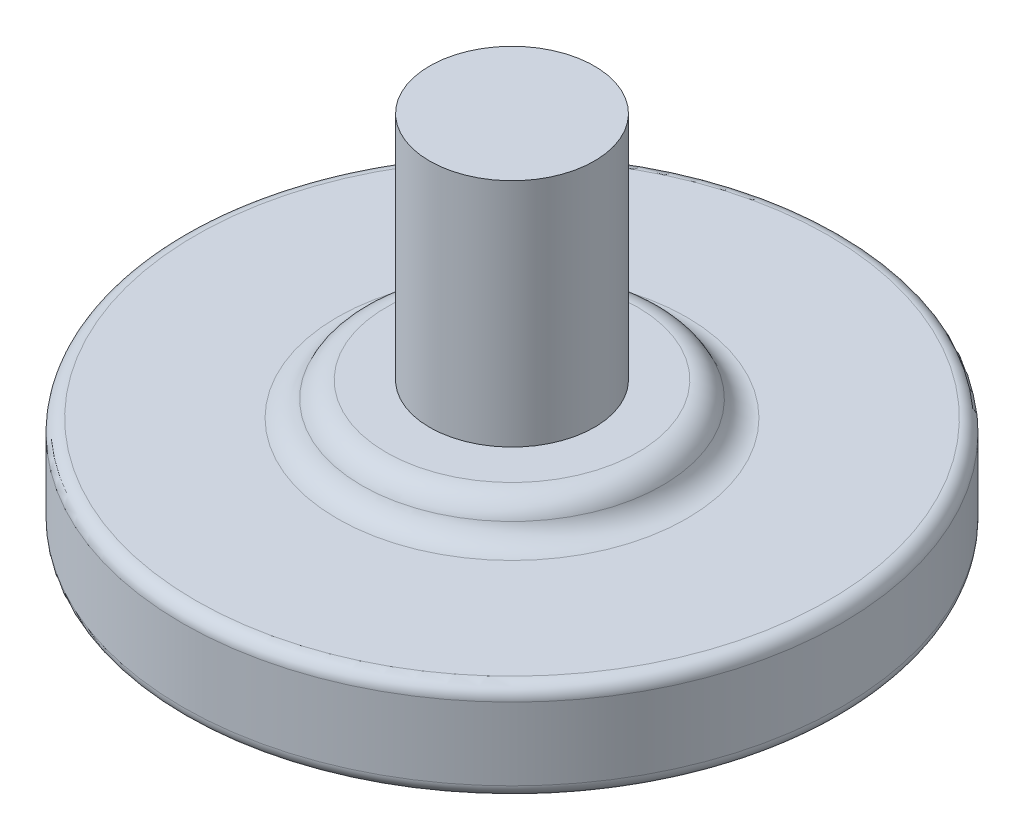
ISO-10303-21;
HEADER;
FILE_DESCRIPTION(('STEP AP214'),'2;1');
FILE_NAME('part.step','',(''),(''),'','','');
FILE_SCHEMA(('AUTOMOTIVE_DESIGN { 1 0 10303 214 1 1 1 1 }'));
ENDSEC;
DATA;
#1=APPLICATION_CONTEXT('core data for automotive mechanical design processes');
#2=APPLICATION_PROTOCOL_DEFINITION('international standard','automotive_design',2000,#1);
#3=PRODUCT_CONTEXT('',#1,'mechanical');
#4=PRODUCT('Part','Part','',(#3));
#5=PRODUCT_RELATED_PRODUCT_CATEGORY('part','',(#4));
#6=PRODUCT_DEFINITION_FORMATION('','',#4);
#7=PRODUCT_DEFINITION_CONTEXT('part definition',#1,'design');
#8=PRODUCT_DEFINITION('design','',#6,#7);
#9=PRODUCT_DEFINITION_SHAPE('','',#8);
#10=(LENGTH_UNIT() NAMED_UNIT(*) SI_UNIT(.MILLI.,.METRE.));
#11=(NAMED_UNIT(*) PLANE_ANGLE_UNIT() SI_UNIT($,.RADIAN.));
#12=(NAMED_UNIT(*) SI_UNIT($,.STERADIAN.) SOLID_ANGLE_UNIT());
#13=UNCERTAINTY_MEASURE_WITH_UNIT(LENGTH_MEASURE(1.E-05),#10,'distance_accuracy_value','');
#14=(GEOMETRIC_REPRESENTATION_CONTEXT(3) GLOBAL_UNCERTAINTY_ASSIGNED_CONTEXT((#13)) GLOBAL_UNIT_ASSIGNED_CONTEXT((#10,
#11,#12)) REPRESENTATION_CONTEXT('',''));
#15=CARTESIAN_POINT('',(0.,0.,0.));
#16=DIRECTION('',(0.,0.,1.));
#17=DIRECTION('',(1.,0.,0.));
#18=AXIS2_PLACEMENT_3D('',#15,#16,#17);
#19=CARTESIAN_POINT('',(0.,3.,0.));
#20=DIRECTION('',(0.,1.,0.));
#21=DIRECTION('',(0.,0.,1.));
#22=AXIS2_PLACEMENT_3D('',#19,#20,#21);
#23=PLANE('',#22);
#24=CARTESIAN_POINT('',(0.,3.,0.));
#25=DIRECTION('',(0.,1.,0.));
#26=DIRECTION('',(0.,0.,1.));
#27=AXIS2_PLACEMENT_3D('',#24,#25,#26);
#28=CIRCLE('',#27,5.3);
#29=CARTESIAN_POINT('',(0.,3.,5.3));
#30=VERTEX_POINT('',#29);
#31=EDGE_CURVE('E42',#30,#30,#28,.F.);
#32=ORIENTED_EDGE('',*,*,#31,.T.);
#33=EDGE_LOOP('',(#32));
#34=FACE_BOUND('',#33,.T.);
#35=CARTESIAN_POINT('',(0.,3.,0.));
#36=DIRECTION('',(0.,1.,0.));
#37=DIRECTION('',(0.,0.,1.));
#38=AXIS2_PLACEMENT_3D('',#35,#36,#37);
#39=CIRCLE('',#38,9.6);
#40=CARTESIAN_POINT('',(0.,3.,9.6));
#41=VERTEX_POINT('',#40);
#42=EDGE_CURVE('E46',#41,#41,#39,.T.);
#43=ORIENTED_EDGE('',*,*,#42,.T.);
#44=EDGE_LOOP('',(#43));
#45=FACE_BOUND('',#44,.T.);
#46=ADVANCED_FACE('F31',(#34,#45),#23,.T.);
#47=CARTESIAN_POINT('',(0.,3.,0.));
#48=DIRECTION('',(0.,-1.,0.));
#49=DIRECTION('',(0.,0.,-1.));
#50=AXIS2_PLACEMENT_3D('',#47,#48,#49);
#51=CYLINDRICAL_SURFACE('',#50,10.);
#52=CARTESIAN_POINT('',(0.,0.4,0.));
#53=DIRECTION('',(0.,1.,0.));
#54=DIRECTION('',(0.,0.,1.));
#55=AXIS2_PLACEMENT_3D('',#52,#53,#54);
#56=CIRCLE('',#55,10.);
#57=CARTESIAN_POINT('',(0.,0.4,10.));
#58=VERTEX_POINT('',#57);
#59=EDGE_CURVE('E54',#58,#58,#56,.T.);
#60=ORIENTED_EDGE('',*,*,#59,.T.);
#61=EDGE_LOOP('',(#60));
#62=FACE_BOUND('',#61,.T.);
#63=CARTESIAN_POINT('',(0.,2.6,0.));
#64=DIRECTION('',(0.,1.,0.));
#65=DIRECTION('',(0.,0.,1.));
#66=AXIS2_PLACEMENT_3D('',#63,#64,#65);
#67=CIRCLE('',#66,10.);
#68=CARTESIAN_POINT('',(0.,2.6,10.));
#69=VERTEX_POINT('',#68);
#70=EDGE_CURVE('E57',#69,#69,#67,.F.);
#71=ORIENTED_EDGE('',*,*,#70,.T.);
#72=EDGE_LOOP('',(#71));
#73=FACE_BOUND('',#72,.T.);
#74=ADVANCED_FACE('F85',(#62,#73),#51,.T.);
#75=CARTESIAN_POINT('',(0.,0.,0.));
#76=DIRECTION('',(0.,1.,0.));
#77=DIRECTION('',(0.,0.,1.));
#78=AXIS2_PLACEMENT_3D('',#75,#76,#77);
#79=PLANE('',#78);
#80=CARTESIAN_POINT('',(0.,0.,0.));
#81=DIRECTION('',(0.,1.,0.));
#82=DIRECTION('',(0.,0.,1.));
#83=AXIS2_PLACEMENT_3D('',#80,#81,#82);
#84=CIRCLE('',#83,9.6);
#85=CARTESIAN_POINT('',(0.,0.,9.6));
#86=VERTEX_POINT('',#85);
#87=EDGE_CURVE('E51',#86,#86,#84,.F.);
#88=ORIENTED_EDGE('',*,*,#87,.T.);
#89=EDGE_LOOP('',(#88));
#90=FACE_BOUND('',#89,.T.);
#91=ADVANCED_FACE('F91',(#90),#79,.F.);
#92=CARTESIAN_POINT('',(0.,0.4,0.));
#93=DIRECTION('',(0.,1.,0.));
#94=DIRECTION('',(0.,0.,1.));
#95=AXIS2_PLACEMENT_3D('',#92,#93,#94);
#96=TOROIDAL_SURFACE('',#95,9.6,0.4);
#97=ORIENTED_EDGE('',*,*,#87,.F.);
#98=EDGE_LOOP('',(#97));
#99=FACE_BOUND('',#98,.T.);
#100=ORIENTED_EDGE('',*,*,#59,.F.);
#101=EDGE_LOOP('',(#100));
#102=FACE_BOUND('',#101,.T.);
#103=ADVANCED_FACE('F81',(#99,#102),#96,.T.);
#104=CARTESIAN_POINT('',(0.,2.6,0.));
#105=DIRECTION('',(0.,1.,0.));
#106=DIRECTION('',(0.,0.,1.));
#107=AXIS2_PLACEMENT_3D('',#104,#105,#106);
#108=TOROIDAL_SURFACE('',#107,9.6,0.4);
#109=ORIENTED_EDGE('',*,*,#70,.F.);
#110=EDGE_LOOP('',(#109));
#111=FACE_BOUND('',#110,.T.);
#112=ORIENTED_EDGE('',*,*,#42,.F.);
#113=EDGE_LOOP('',(#112));
#114=FACE_BOUND('',#113,.T.);
#115=ADVANCED_FACE('F73',(#111,#114),#108,.T.);
#116=CARTESIAN_POINT('',(0.,4.,0.));
#117=DIRECTION('',(0.,1.,0.));
#118=DIRECTION('',(0.,0.,1.));
#119=AXIS2_PLACEMENT_3D('',#116,#117,#118);
#120=PLANE('',#119);
#121=CARTESIAN_POINT('',(0.,4.,0.));
#122=DIRECTION('',(0.,1.,0.));
#123=DIRECTION('',(0.,0.,1.));
#124=AXIS2_PLACEMENT_3D('',#121,#122,#123);
#125=CIRCLE('',#124,3.81676030258087);
#126=CARTESIAN_POINT('',(0.,4.,3.81676030258087));
#127=VERTEX_POINT('',#126);
#128=EDGE_CURVE('E38',#127,#127,#125,.T.);
#129=ORIENTED_EDGE('',*,*,#128,.T.);
#130=EDGE_LOOP('',(#129));
#131=FACE_BOUND('',#130,.T.);
#132=CARTESIAN_POINT('',(0.,4.,0.));
#133=DIRECTION('',(0.,1.,0.));
#134=DIRECTION('',(0.,0.,1.));
#135=AXIS2_PLACEMENT_3D('',#132,#133,#134);
#136=CIRCLE('',#135,2.5);
#137=CARTESIAN_POINT('',(0.,4.,2.5));
#138=VERTEX_POINT('',#137);
#139=EDGE_CURVE('E63',#138,#138,#136,.T.);
#140=ORIENTED_EDGE('',*,*,#139,.F.);
#141=EDGE_LOOP('',(#140));
#142=FACE_BOUND('',#141,.T.);
#143=ADVANCED_FACE('F70',(#131,#142),#120,.T.);
#144=CARTESIAN_POINT('',(0.,11.,0.));
#145=DIRECTION('',(0.,1.,0.));
#146=DIRECTION('',(0.,0.,1.));
#147=AXIS2_PLACEMENT_3D('',#144,#145,#146);
#148=PLANE('',#147);
#149=CARTESIAN_POINT('',(0.,11.,0.));
#150=DIRECTION('',(0.,1.,0.));
#151=DIRECTION('',(0.,0.,1.));
#152=AXIS2_PLACEMENT_3D('',#149,#150,#151);
#153=CIRCLE('',#152,2.5);
#154=CARTESIAN_POINT('',(0.,11.,2.5));
#155=VERTEX_POINT('',#154);
#156=EDGE_CURVE('E60',#155,#155,#153,.T.);
#157=ORIENTED_EDGE('',*,*,#156,.T.);
#158=EDGE_LOOP('',(#157));
#159=FACE_BOUND('',#158,.T.);
#160=ADVANCED_FACE('F72',(#159),#148,.T.);
#161=CARTESIAN_POINT('',(0.,11.,0.));
#162=DIRECTION('',(0.,-1.,0.));
#163=DIRECTION('',(0.,0.,-1.));
#164=AXIS2_PLACEMENT_3D('',#161,#162,#163);
#165=CYLINDRICAL_SURFACE('',#164,2.5);
#166=ORIENTED_EDGE('',*,*,#139,.T.);
#167=EDGE_LOOP('',(#166));
#168=FACE_BOUND('',#167,.T.);
#169=ORIENTED_EDGE('',*,*,#156,.F.);
#170=EDGE_LOOP('',(#169));
#171=FACE_BOUND('',#170,.T.);
#172=ADVANCED_FACE('F67',(#168,#171),#165,.T.);
#173=CARTESIAN_POINT('',(0.,3.8,0.));
#174=DIRECTION('',(0.,1.,0.));
#175=DIRECTION('',(0.,0.,1.));
#176=AXIS2_PLACEMENT_3D('',#173,#174,#175);
#177=TOROIDAL_SURFACE('',#176,5.3,0.8);
#178=CARTESIAN_POINT('',(0.,3.5,0.));
#179=DIRECTION('',(0.,1.,0.));
#180=DIRECTION('',(0.,0.,1.));
#181=AXIS2_PLACEMENT_3D('',#178,#179,#180);
#182=CIRCLE('',#181,4.55838015129044);
#183=CARTESIAN_POINT('',(0.,3.5,4.55838015129044));
#184=VERTEX_POINT('',#183);
#185=EDGE_CURVE('E10',#184,#184,#182,.F.);
#186=ORIENTED_EDGE('',*,*,#185,.T.);
#187=EDGE_LOOP('',(#186));
#188=FACE_BOUND('',#187,.T.);
#189=ORIENTED_EDGE('',*,*,#31,.F.);
#190=EDGE_LOOP('',(#189));
#191=FACE_BOUND('',#190,.T.);
#192=ADVANCED_FACE('F102',(#188,#191),#177,.F.);
#193=CARTESIAN_POINT('',(0.,3.2,0.));
#194=DIRECTION('',(0.,-1.,0.));
#195=DIRECTION('',(0.,0.,-1.));
#196=AXIS2_PLACEMENT_3D('',#193,#194,#195);
#197=TOROIDAL_SURFACE('',#196,3.81676030258087,0.8);
#198=ORIENTED_EDGE('',*,*,#185,.F.);
#199=EDGE_LOOP('',(#198));
#200=FACE_BOUND('',#199,.T.);
#201=ORIENTED_EDGE('',*,*,#128,.F.);
#202=EDGE_LOOP('',(#201));
#203=FACE_BOUND('',#202,.T.);
#204=ADVANCED_FACE('F33',(#200,#203),#197,.T.);
#205=CLOSED_SHELL('',(#46,#74,#91,#103,#115,#143,#160,#172,#192,#204));
#206=MANIFOLD_SOLID_BREP('B2',#205);
#207=ADVANCED_BREP_SHAPE_REPRESENTATION('',(#18,#206),#14);
#208=SHAPE_DEFINITION_REPRESENTATION(#9,#207);
ENDSEC;
END-ISO-10303-21;
